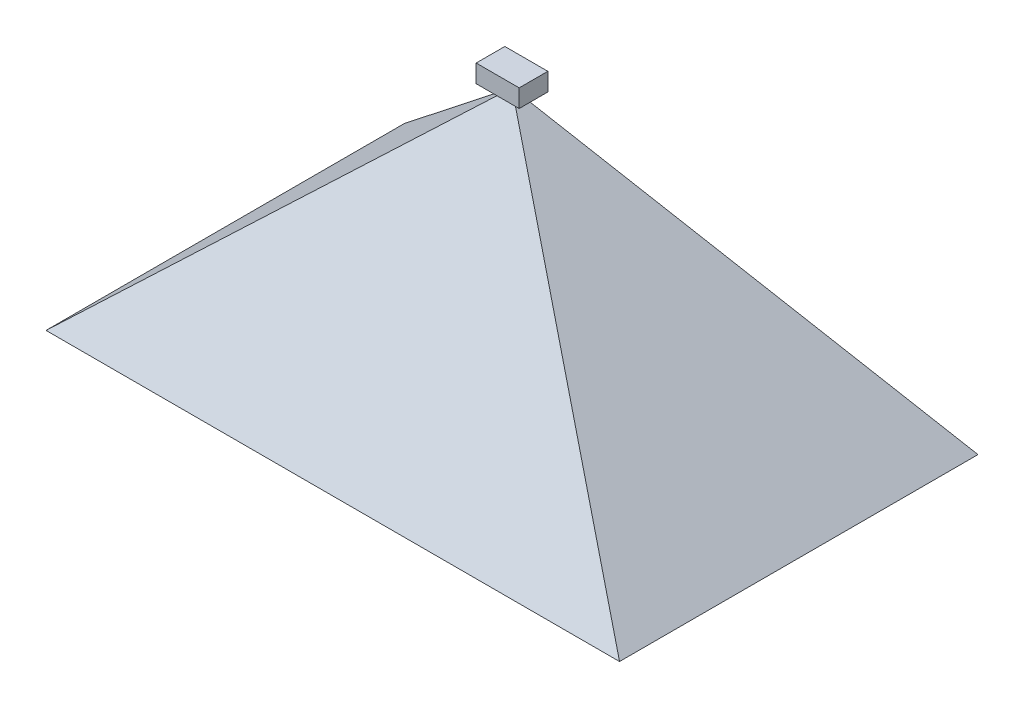
ISO-10303-21;
HEADER;
FILE_DESCRIPTION(('STEP AP214'),'2;1');
FILE_NAME('part.step','',(''),(''),'','','');
FILE_SCHEMA(('AUTOMOTIVE_DESIGN { 1 0 10303 214 1 1 1 1 }'));
ENDSEC;
DATA;
#1=APPLICATION_CONTEXT('core data for automotive mechanical design processes');
#2=APPLICATION_PROTOCOL_DEFINITION('international standard','automotive_design',2000,#1);
#3=PRODUCT_CONTEXT('',#1,'mechanical');
#4=PRODUCT('Part','Part','',(#3));
#5=PRODUCT_RELATED_PRODUCT_CATEGORY('part','',(#4));
#6=PRODUCT_DEFINITION_FORMATION('','',#4);
#7=PRODUCT_DEFINITION_CONTEXT('part definition',#1,'design');
#8=PRODUCT_DEFINITION('design','',#6,#7);
#9=PRODUCT_DEFINITION_SHAPE('','',#8);
#10=(LENGTH_UNIT() NAMED_UNIT(*) SI_UNIT(.MILLI.,.METRE.));
#11=(NAMED_UNIT(*) PLANE_ANGLE_UNIT() SI_UNIT($,.RADIAN.));
#12=(NAMED_UNIT(*) SI_UNIT($,.STERADIAN.) SOLID_ANGLE_UNIT());
#13=UNCERTAINTY_MEASURE_WITH_UNIT(LENGTH_MEASURE(1.E-05),#10,'distance_accuracy_value','');
#14=(GEOMETRIC_REPRESENTATION_CONTEXT(3) GLOBAL_UNCERTAINTY_ASSIGNED_CONTEXT((#13)) GLOBAL_UNIT_ASSIGNED_CONTEXT((#10,
#11,#12)) REPRESENTATION_CONTEXT('',''));
#15=CARTESIAN_POINT('',(0.,0.,0.));
#16=DIRECTION('',(0.,0.,1.));
#17=DIRECTION('',(1.,0.,0.));
#18=AXIS2_PLACEMENT_3D('',#15,#16,#17);
#19=CARTESIAN_POINT('',(0.,90.932,0.));
#20=DIRECTION('',(0.,-1.,0.));
#21=DIRECTION('',(0.,0.,-1.));
#22=AXIS2_PLACEMENT_3D('',#19,#20,#21);
#23=PLANE('',#22);
#24=CARTESIAN_POINT('',(0.,90.932,0.));
#25=DIRECTION('',(0.,1.,0.));
#26=DIRECTION('',(0.,0.,1.));
#27=AXIS2_PLACEMENT_3D('',#24,#25,#26);
#28=CIRCLE('',#27,2.54);
#29=CARTESIAN_POINT('',(1.86705551817328,90.932,1.72212185749048));
#30=VERTEX_POINT('',#29);
#31=CARTESIAN_POINT('',(1.86705551817655,90.932,-1.72212185749048));
#32=VERTEX_POINT('',#31);
#33=EDGE_CURVE('E63',#30,#32,#28,.T.);
#34=ORIENTED_EDGE('',*,*,#33,.F.);
#35=DIRECTION('',(1.,0.,0.));
#36=VECTOR('',#35,1.);
#37=CARTESIAN_POINT('',(-2.75539497198477,90.932,1.72212185749048));
#38=LINE('',#37,#36);
#39=CARTESIAN_POINT('',(2.75539497198476,90.932,1.72212185749048));
#40=VERTEX_POINT('',#39);
#41=EDGE_CURVE('E369',#30,#40,#38,.T.);
#42=ORIENTED_EDGE('',*,*,#41,.T.);
#43=DIRECTION('',(0.,0.,-1.));
#44=VECTOR('',#43,1.);
#45=CARTESIAN_POINT('',(2.75539497198476,90.932,1.72212185749048));
#46=LINE('',#45,#44);
#47=CARTESIAN_POINT('',(2.75539497198476,90.932,-1.72212185749048));
#48=VERTEX_POINT('',#47);
#49=EDGE_CURVE('E303',#40,#48,#46,.T.);
#50=ORIENTED_EDGE('',*,*,#49,.T.);
#51=DIRECTION('',(-1.,0.,0.));
#52=VECTOR('',#51,1.);
#53=CARTESIAN_POINT('',(-2.75539497198477,90.932,-1.72212185749048));
#54=LINE('',#53,#52);
#55=EDGE_CURVE('E370',#48,#32,#54,.T.);
#56=ORIENTED_EDGE('',*,*,#55,.T.);
#57=EDGE_LOOP('',(#34,#42,#50,#56));
#58=FACE_BOUND('',#57,.T.);
#59=ADVANCED_FACE('F44',(#58),#23,.F.);
#60=CARTESIAN_POINT('',(-1.86705551817329,90.932,-1.72212185749048));
#61=VERTEX_POINT('',#60);
#62=CARTESIAN_POINT('',(-1.86705551817656,90.932,1.72212185749048));
#63=VERTEX_POINT('',#62);
#64=EDGE_CURVE('E12',#61,#63,#28,.T.);
#65=ORIENTED_EDGE('',*,*,#64,.F.);
#66=CARTESIAN_POINT('',(-2.75539497198477,90.932,-1.72212185749048));
#67=VERTEX_POINT('',#66);
#68=EDGE_CURVE('E331',#61,#67,#54,.T.);
#69=ORIENTED_EDGE('',*,*,#68,.T.);
#70=DIRECTION('',(0.,0.,1.));
#71=VECTOR('',#70,1.);
#72=CARTESIAN_POINT('',(-2.75539497198477,90.932,1.72212185749048));
#73=LINE('',#72,#71);
#74=CARTESIAN_POINT('',(-2.75539497198477,90.932,1.72212185749048));
#75=VERTEX_POINT('',#74);
#76=EDGE_CURVE('E363',#67,#75,#73,.T.);
#77=ORIENTED_EDGE('',*,*,#76,.T.);
#78=EDGE_CURVE('E55',#75,#63,#38,.T.);
#79=ORIENTED_EDGE('',*,*,#78,.T.);
#80=EDGE_LOOP('',(#65,#69,#77,#79));
#81=FACE_BOUND('',#80,.T.);
#82=ADVANCED_FACE('F348',(#81),#23,.F.);
#83=CARTESIAN_POINT('',(0.,0.,0.));
#84=DIRECTION('',(0.,-1.,0.));
#85=DIRECTION('',(0.,0.,-1.));
#86=AXIS2_PLACEMENT_3D('',#83,#84,#85);
#87=PLANE('',#86);
#88=DIRECTION('',(0.,0.,-1.));
#89=VECTOR('',#88,1.);
#90=CARTESIAN_POINT('',(101.6,0.,63.5));
#91=LINE('',#90,#89);
#92=CARTESIAN_POINT('',(101.6,0.,63.5));
#93=VERTEX_POINT('',#92);
#94=CARTESIAN_POINT('',(101.6,0.,-63.5));
#95=VERTEX_POINT('',#94);
#96=EDGE_CURVE('E161',#93,#95,#91,.T.);
#97=ORIENTED_EDGE('',*,*,#96,.F.);
#98=DIRECTION('',(1.,0.,0.));
#99=VECTOR('',#98,1.);
#100=CARTESIAN_POINT('',(-101.6,0.,63.5));
#101=LINE('',#100,#99);
#102=CARTESIAN_POINT('',(-101.6,0.,63.5));
#103=VERTEX_POINT('',#102);
#104=EDGE_CURVE('E394',#103,#93,#101,.T.);
#105=ORIENTED_EDGE('',*,*,#104,.F.);
#106=DIRECTION('',(0.,0.,1.));
#107=VECTOR('',#106,1.);
#108=CARTESIAN_POINT('',(-101.6,0.,63.5));
#109=LINE('',#108,#107);
#110=CARTESIAN_POINT('',(-101.6,0.,-63.5));
#111=VERTEX_POINT('',#110);
#112=EDGE_CURVE('E252',#111,#103,#109,.T.);
#113=ORIENTED_EDGE('',*,*,#112,.F.);
#114=DIRECTION('',(-1.,0.,0.));
#115=VECTOR('',#114,1.);
#116=CARTESIAN_POINT('',(-101.6,0.,-63.5));
#117=LINE('',#116,#115);
#118=EDGE_CURVE('E266',#95,#111,#117,.T.);
#119=ORIENTED_EDGE('',*,*,#118,.F.);
#120=EDGE_LOOP('',(#97,#105,#113,#119));
#121=FACE_BOUND('',#120,.T.);
#122=ADVANCED_FACE('F46',(#121),#87,.T.);
#123=CARTESIAN_POINT('',(-46.5712092713608,50.623683478915,0.));
#124=DIRECTION('',(-0.677036220603785,0.7359496966441,0.));
#125=DIRECTION('',(-0.7359496966441,-0.677036220603785,0.));
#126=AXIS2_PLACEMENT_3D('',#123,#124,#125);
#127=PLANE('',#126);
#128=DIRECTION('',(-0.668611253679175,-0.615088284305683,-0.417882033549485));
#129=VECTOR('',#128,1.);
#130=CARTESIAN_POINT('',(-2.75539497198477,90.932,-1.72212185749048));
#131=LINE('',#130,#129);
#132=EDGE_CURVE('E309',#67,#111,#131,.T.);
#133=ORIENTED_EDGE('',*,*,#132,.T.);
#134=ORIENTED_EDGE('',*,*,#112,.T.);
#135=DIRECTION('',(-0.668611253679175,-0.615088284305683,0.417882033549485));
#136=VECTOR('',#135,1.);
#137=CARTESIAN_POINT('',(-2.75539497198477,90.932,1.72212185749048));
#138=LINE('',#137,#136);
#139=EDGE_CURVE('E217',#75,#103,#138,.T.);
#140=ORIENTED_EDGE('',*,*,#139,.F.);
#141=ORIENTED_EDGE('',*,*,#76,.F.);
#142=EDGE_LOOP('',(#133,#134,#140,#141));
#143=FACE_BOUND('',#142,.T.);
#144=ADVANCED_FACE('F232',(#143),#127,.T.);
#145=CARTESIAN_POINT('',(0.,29.5169823376703,43.4465915410284));
#146=DIRECTION('',(0.,0.561962372419454,0.827162796542917));
#147=DIRECTION('',(0.,-0.827162796542917,0.561962372419454));
#148=AXIS2_PLACEMENT_3D('',#145,#146,#147);
#149=PLANE('',#148);
#150=ORIENTED_EDGE('',*,*,#139,.T.);
#151=ORIENTED_EDGE('',*,*,#104,.T.);
#152=DIRECTION('',(0.668611253679175,-0.615088284305683,0.417882033549485));
#153=VECTOR('',#152,1.);
#154=CARTESIAN_POINT('',(2.75539497198476,90.932,1.72212185749048));
#155=LINE('',#154,#153);
#156=EDGE_CURVE('E310',#40,#93,#155,.T.);
#157=ORIENTED_EDGE('',*,*,#156,.F.);
#158=ORIENTED_EDGE('',*,*,#41,.F.);
#159=EDGE_CURVE('E49',#63,#30,#38,.T.);
#160=ORIENTED_EDGE('',*,*,#159,.F.);
#161=ORIENTED_EDGE('',*,*,#78,.F.);
#162=EDGE_LOOP('',(#150,#151,#157,#158,#160,#161));
#163=FACE_BOUND('',#162,.T.);
#164=ADVANCED_FACE('F221',(#163),#149,.T.);
#165=CARTESIAN_POINT('',(0.,29.5169823376703,-43.4465915410284));
#166=DIRECTION('',(0.,0.561962372419454,-0.827162796542917));
#167=DIRECTION('',(0.,0.827162796542917,0.561962372419454));
#168=AXIS2_PLACEMENT_3D('',#165,#166,#167);
#169=PLANE('',#168);
#170=DIRECTION('',(0.668611253679175,-0.615088284305683,-0.417882033549485));
#171=VECTOR('',#170,1.);
#172=CARTESIAN_POINT('',(2.75539497198476,90.932,-1.72212185749048));
#173=LINE('',#172,#171);
#174=EDGE_CURVE('E307',#48,#95,#173,.T.);
#175=ORIENTED_EDGE('',*,*,#174,.T.);
#176=ORIENTED_EDGE('',*,*,#118,.T.);
#177=ORIENTED_EDGE('',*,*,#132,.F.);
#178=ORIENTED_EDGE('',*,*,#68,.F.);
#179=EDGE_CURVE('E326',#32,#61,#54,.T.);
#180=ORIENTED_EDGE('',*,*,#179,.F.);
#181=ORIENTED_EDGE('',*,*,#55,.F.);
#182=EDGE_LOOP('',(#175,#176,#177,#178,#180,#181));
#183=FACE_BOUND('',#182,.T.);
#184=ADVANCED_FACE('F231',(#183),#169,.T.);
#185=CARTESIAN_POINT('',(46.5712092713608,50.623683478915,0.));
#186=DIRECTION('',(0.677036220603785,0.7359496966441,0.));
#187=DIRECTION('',(-0.7359496966441,0.677036220603785,0.));
#188=AXIS2_PLACEMENT_3D('',#185,#186,#187);
#189=PLANE('',#188);
#190=ORIENTED_EDGE('',*,*,#156,.T.);
#191=ORIENTED_EDGE('',*,*,#96,.T.);
#192=ORIENTED_EDGE('',*,*,#174,.F.);
#193=ORIENTED_EDGE('',*,*,#49,.F.);
#194=EDGE_LOOP('',(#190,#191,#192,#193));
#195=FACE_BOUND('',#194,.T.);
#196=ADVANCED_FACE('F194',(#195),#189,.T.);
#197=CARTESIAN_POINT('',(0.,90.932,0.));
#198=DIRECTION('',(0.,1.,0.));
#199=DIRECTION('',(0.,0.,1.));
#200=AXIS2_PLACEMENT_3D('',#197,#198,#199);
#201=PLANE('',#200);
#202=EDGE_CURVE('E152',#32,#61,#28,.T.);
#203=ORIENTED_EDGE('',*,*,#202,.F.);
#204=ORIENTED_EDGE('',*,*,#179,.T.);
#205=EDGE_LOOP('',(#203,#204));
#206=FACE_BOUND('',#205,.T.);
#207=ADVANCED_FACE('F183',(#206),#201,.F.);
#208=EDGE_CURVE('E149',#63,#30,#28,.T.);
#209=ORIENTED_EDGE('',*,*,#208,.F.);
#210=ORIENTED_EDGE('',*,*,#159,.T.);
#211=EDGE_LOOP('',(#209,#210));
#212=FACE_BOUND('',#211,.T.);
#213=ADVANCED_FACE('F193',(#212),#201,.F.);
#214=CARTESIAN_POINT('',(0.,93.472,0.));
#215=DIRECTION('',(0.,-1.,0.));
#216=DIRECTION('',(0.,0.,-1.));
#217=AXIS2_PLACEMENT_3D('',#214,#215,#216);
#218=CYLINDRICAL_SURFACE('',#217,2.54);
#219=CARTESIAN_POINT('',(0.,93.472,0.));
#220=DIRECTION('',(0.,1.,0.));
#221=DIRECTION('',(0.,0.,1.));
#222=AXIS2_PLACEMENT_3D('',#219,#220,#221);
#223=CIRCLE('',#222,2.54);
#224=CARTESIAN_POINT('',(0.,93.472,2.54));
#225=VERTEX_POINT('',#224);
#226=EDGE_CURVE('E158',#225,#225,#223,.T.);
#227=ORIENTED_EDGE('',*,*,#226,.F.);
#228=EDGE_LOOP('',(#227));
#229=FACE_BOUND('',#228,.T.);
#230=ORIENTED_EDGE('',*,*,#33,.T.);
#231=ORIENTED_EDGE('',*,*,#202,.T.);
#232=ORIENTED_EDGE('',*,*,#64,.T.);
#233=ORIENTED_EDGE('',*,*,#208,.T.);
#234=EDGE_LOOP('',(#230,#231,#232,#233));
#235=FACE_BOUND('',#234,.T.);
#236=ADVANCED_FACE('F197',(#229,#235),#218,.T.);
#237=CARTESIAN_POINT('',(0.,93.472,0.));
#238=DIRECTION('',(0.,-1.,0.));
#239=DIRECTION('',(0.,0.,-1.));
#240=AXIS2_PLACEMENT_3D('',#237,#238,#239);
#241=PLANE('',#240);
#242=DIRECTION('',(0.,0.,1.));
#243=VECTOR('',#242,1.);
#244=CARTESIAN_POINT('',(-7.62,93.472,-5.08));
#245=LINE('',#244,#243);
#246=CARTESIAN_POINT('',(-7.62,93.472,-5.08));
#247=VERTEX_POINT('',#246);
#248=CARTESIAN_POINT('',(-7.62,93.472,5.08));
#249=VERTEX_POINT('',#248);
#250=EDGE_CURVE('E148',#247,#249,#245,.T.);
#251=ORIENTED_EDGE('',*,*,#250,.F.);
#252=DIRECTION('',(-1.,0.,0.));
#253=VECTOR('',#252,1.);
#254=CARTESIAN_POINT('',(7.62,93.472,-5.08));
#255=LINE('',#254,#253);
#256=CARTESIAN_POINT('',(7.62,93.472,-5.08));
#257=VERTEX_POINT('',#256);
#258=EDGE_CURVE('E144',#257,#247,#255,.T.);
#259=ORIENTED_EDGE('',*,*,#258,.F.);
#260=DIRECTION('',(0.,0.,-1.));
#261=VECTOR('',#260,1.);
#262=CARTESIAN_POINT('',(7.62,93.472,-5.08));
#263=LINE('',#262,#261);
#264=CARTESIAN_POINT('',(7.62,93.472,5.08));
#265=VERTEX_POINT('',#264);
#266=EDGE_CURVE('E540',#265,#257,#263,.T.);
#267=ORIENTED_EDGE('',*,*,#266,.F.);
#268=DIRECTION('',(1.,0.,0.));
#269=VECTOR('',#268,1.);
#270=CARTESIAN_POINT('',(7.62,93.472,5.08));
#271=LINE('',#270,#269);
#272=EDGE_CURVE('E544',#249,#265,#271,.T.);
#273=ORIENTED_EDGE('',*,*,#272,.F.);
#274=EDGE_LOOP('',(#251,#259,#267,#273));
#275=FACE_BOUND('',#274,.T.);
#276=ORIENTED_EDGE('',*,*,#226,.T.);
#277=EDGE_LOOP('',(#276));
#278=FACE_BOUND('',#277,.T.);
#279=ADVANCED_FACE('F480',(#275,#278),#241,.T.);
#280=CARTESIAN_POINT('',(-7.62,99.822,-5.08));
#281=DIRECTION('',(1.,0.,0.));
#282=DIRECTION('',(0.,0.,-1.));
#283=AXIS2_PLACEMENT_3D('',#280,#281,#282);
#284=PLANE('',#283);
#285=ORIENTED_EDGE('',*,*,#250,.T.);
#286=DIRECTION('',(0.,-1.,0.));
#287=VECTOR('',#286,1.);
#288=CARTESIAN_POINT('',(-7.62,99.822,5.08));
#289=LINE('',#288,#287);
#290=CARTESIAN_POINT('',(-7.62,99.822,5.08));
#291=VERTEX_POINT('',#290);
#292=EDGE_CURVE('E128',#291,#249,#289,.T.);
#293=ORIENTED_EDGE('',*,*,#292,.F.);
#294=DIRECTION('',(0.,0.,1.));
#295=VECTOR('',#294,1.);
#296=CARTESIAN_POINT('',(-7.62,99.822,-5.08));
#297=LINE('',#296,#295);
#298=CARTESIAN_POINT('',(-7.62,99.822,-5.08));
#299=VERTEX_POINT('',#298);
#300=EDGE_CURVE('E135',#299,#291,#297,.T.);
#301=ORIENTED_EDGE('',*,*,#300,.F.);
#302=DIRECTION('',(0.,-1.,0.));
#303=VECTOR('',#302,1.);
#304=CARTESIAN_POINT('',(-7.62,99.822,-5.08));
#305=LINE('',#304,#303);
#306=EDGE_CURVE('E537',#299,#247,#305,.T.);
#307=ORIENTED_EDGE('',*,*,#306,.T.);
#308=EDGE_LOOP('',(#285,#293,#301,#307));
#309=FACE_BOUND('',#308,.T.);
#310=ADVANCED_FACE('F146',(#309),#284,.F.);
#311=CARTESIAN_POINT('',(7.62,99.822,5.08));
#312=DIRECTION('',(0.,0.,-1.));
#313=DIRECTION('',(-1.,0.,0.));
#314=AXIS2_PLACEMENT_3D('',#311,#312,#313);
#315=PLANE('',#314);
#316=ORIENTED_EDGE('',*,*,#272,.T.);
#317=DIRECTION('',(0.,-1.,0.));
#318=VECTOR('',#317,1.);
#319=CARTESIAN_POINT('',(7.62,99.822,5.08));
#320=LINE('',#319,#318);
#321=CARTESIAN_POINT('',(7.62,99.822,5.08));
#322=VERTEX_POINT('',#321);
#323=EDGE_CURVE('E131',#322,#265,#320,.T.);
#324=ORIENTED_EDGE('',*,*,#323,.F.);
#325=DIRECTION('',(1.,0.,0.));
#326=VECTOR('',#325,1.);
#327=CARTESIAN_POINT('',(7.62,99.822,5.08));
#328=LINE('',#327,#326);
#329=EDGE_CURVE('E124',#291,#322,#328,.T.);
#330=ORIENTED_EDGE('',*,*,#329,.F.);
#331=ORIENTED_EDGE('',*,*,#292,.T.);
#332=EDGE_LOOP('',(#316,#324,#330,#331));
#333=FACE_BOUND('',#332,.T.);
#334=ADVANCED_FACE('F126',(#333),#315,.F.);
#335=CARTESIAN_POINT('',(7.62,99.822,-5.08));
#336=DIRECTION('',(-1.,0.,0.));
#337=DIRECTION('',(0.,0.,1.));
#338=AXIS2_PLACEMENT_3D('',#335,#336,#337);
#339=PLANE('',#338);
#340=ORIENTED_EDGE('',*,*,#266,.T.);
#341=DIRECTION('',(0.,-1.,0.));
#342=VECTOR('',#341,1.);
#343=CARTESIAN_POINT('',(7.62,99.822,-5.08));
#344=LINE('',#343,#342);
#345=CARTESIAN_POINT('',(7.62,99.822,-5.08));
#346=VERTEX_POINT('',#345);
#347=EDGE_CURVE('E154',#346,#257,#344,.T.);
#348=ORIENTED_EDGE('',*,*,#347,.F.);
#349=DIRECTION('',(0.,0.,-1.));
#350=VECTOR('',#349,1.);
#351=CARTESIAN_POINT('',(7.62,99.822,-5.08));
#352=LINE('',#351,#350);
#353=EDGE_CURVE('E134',#322,#346,#352,.T.);
#354=ORIENTED_EDGE('',*,*,#353,.F.);
#355=ORIENTED_EDGE('',*,*,#323,.T.);
#356=EDGE_LOOP('',(#340,#348,#354,#355));
#357=FACE_BOUND('',#356,.T.);
#358=ADVANCED_FACE('F505',(#357),#339,.F.);
#359=CARTESIAN_POINT('',(7.62,99.822,-5.08));
#360=DIRECTION('',(0.,0.,1.));
#361=DIRECTION('',(1.,0.,0.));
#362=AXIS2_PLACEMENT_3D('',#359,#360,#361);
#363=PLANE('',#362);
#364=ORIENTED_EDGE('',*,*,#258,.T.);
#365=ORIENTED_EDGE('',*,*,#306,.F.);
#366=DIRECTION('',(-1.,0.,0.));
#367=VECTOR('',#366,1.);
#368=CARTESIAN_POINT('',(7.62,99.822,-5.08));
#369=LINE('',#368,#367);
#370=EDGE_CURVE('E140',#346,#299,#369,.T.);
#371=ORIENTED_EDGE('',*,*,#370,.F.);
#372=ORIENTED_EDGE('',*,*,#347,.T.);
#373=EDGE_LOOP('',(#364,#365,#371,#372));
#374=FACE_BOUND('',#373,.T.);
#375=ADVANCED_FACE('F513',(#374),#363,.F.);
#376=CARTESIAN_POINT('',(0.,99.822,0.));
#377=DIRECTION('',(0.,-1.,0.));
#378=DIRECTION('',(0.,0.,-1.));
#379=AXIS2_PLACEMENT_3D('',#376,#377,#378);
#380=PLANE('',#379);
#381=ORIENTED_EDGE('',*,*,#300,.T.);
#382=ORIENTED_EDGE('',*,*,#329,.T.);
#383=ORIENTED_EDGE('',*,*,#353,.T.);
#384=ORIENTED_EDGE('',*,*,#370,.T.);
#385=EDGE_LOOP('',(#381,#382,#383,#384));
#386=FACE_BOUND('',#385,.T.);
#387=ADVANCED_FACE('F138',(#386),#380,.F.);
#388=CLOSED_SHELL('',(#59,#82,#122,#144,#164,#184,#196,#207,#213,#236,#279,#310,#334,#358,#375,#387));
#389=MANIFOLD_SOLID_BREP('B2',#388);
#390=ADVANCED_BREP_SHAPE_REPRESENTATION('',(#18,#389),#14);
#391=SHAPE_DEFINITION_REPRESENTATION(#9,#390);
ENDSEC;
END-ISO-10303-21;
